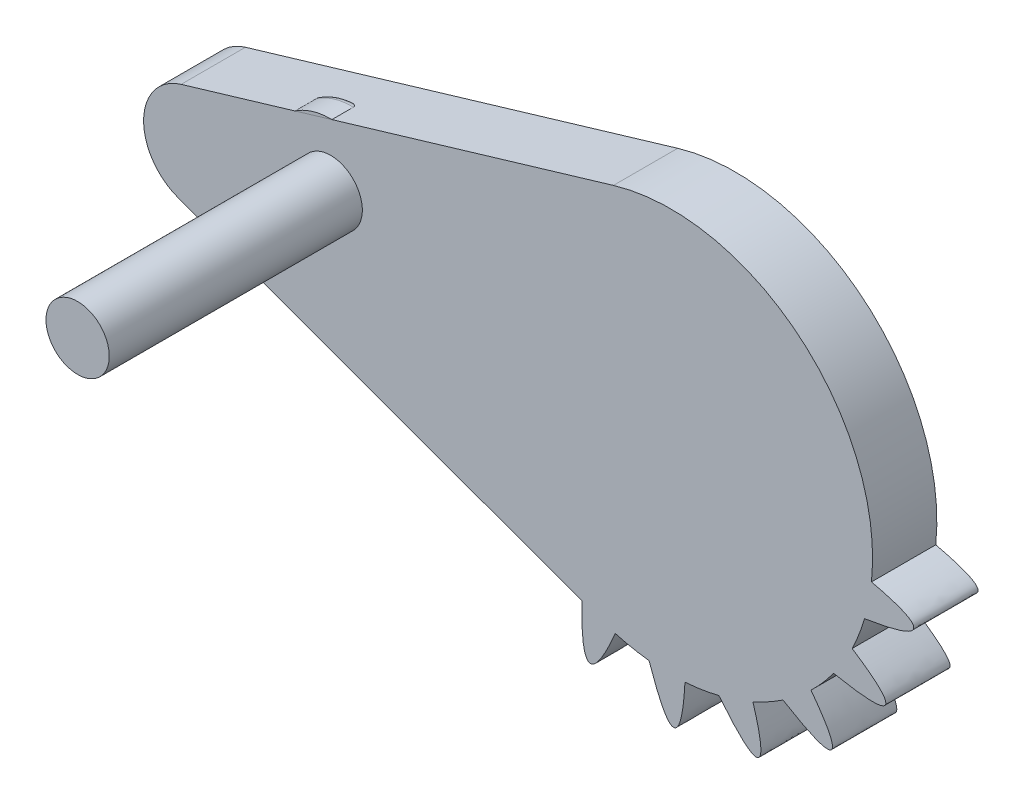
ISO-10303-21;
HEADER;
FILE_DESCRIPTION(('STEP AP214'),'2;1');
FILE_NAME('part.step','',(''),(''),'','','');
FILE_SCHEMA(('AUTOMOTIVE_DESIGN { 1 0 10303 214 1 1 1 1 }'));
ENDSEC;
DATA;
#1=APPLICATION_CONTEXT('core data for automotive mechanical design processes');
#2=APPLICATION_PROTOCOL_DEFINITION('international standard','automotive_design',2000,#1);
#3=PRODUCT_CONTEXT('',#1,'mechanical');
#4=PRODUCT('Part','Part','',(#3));
#5=PRODUCT_RELATED_PRODUCT_CATEGORY('part','',(#4));
#6=PRODUCT_DEFINITION_FORMATION('','',#4);
#7=PRODUCT_DEFINITION_CONTEXT('part definition',#1,'design');
#8=PRODUCT_DEFINITION('design','',#6,#7);
#9=PRODUCT_DEFINITION_SHAPE('','',#8);
#10=(LENGTH_UNIT() NAMED_UNIT(*) SI_UNIT(.MILLI.,.METRE.));
#11=(NAMED_UNIT(*) PLANE_ANGLE_UNIT() SI_UNIT($,.RADIAN.));
#12=(NAMED_UNIT(*) SI_UNIT($,.STERADIAN.) SOLID_ANGLE_UNIT());
#13=UNCERTAINTY_MEASURE_WITH_UNIT(LENGTH_MEASURE(1.E-05),#10,'distance_accuracy_value','');
#14=(GEOMETRIC_REPRESENTATION_CONTEXT(3) GLOBAL_UNCERTAINTY_ASSIGNED_CONTEXT((#13)) GLOBAL_UNIT_ASSIGNED_CONTEXT((#10,
#11,#12)) REPRESENTATION_CONTEXT('',''));
#15=CARTESIAN_POINT('',(0.,0.,0.));
#16=DIRECTION('',(0.,0.,1.));
#17=DIRECTION('',(1.,0.,0.));
#18=AXIS2_PLACEMENT_3D('',#15,#16,#17);
#19=CARTESIAN_POINT('',(-53.7801567329168,7.3152558516244,18.66));
#20=DIRECTION('',(0.,0.,-1.));
#21=DIRECTION('',(0.,1.,0.));
#22=AXIS2_PLACEMENT_3D('',#19,#20,#21);
#23=SPHERICAL_SURFACE('',#22,16.);
#24=CARTESIAN_POINT('',(-53.7801567329168,7.3152558516244,5.79558937890291));
#25=DIRECTION('',(0.,0.,-1.));
#26=DIRECTION('',(-1.,0.,0.));
#27=AXIS2_PLACEMENT_3D('',#24,#25,#26);
#28=CIRCLE('',#27,9.51351351351351);
#29=CARTESIAN_POINT('',(-63.2936702464303,7.3152558516244,5.79558937890291));
#30=VERTEX_POINT('',#29);
#31=EDGE_CURVE('E171',#30,#30,#28,.T.);
#32=ORIENTED_EDGE('',*,*,#31,.T.);
#33=EDGE_LOOP('',(#32));
#34=FACE_BOUND('',#33,.T.);
#35=CARTESIAN_POINT('',(-53.7801567329168,7.02835413391622,18.6383292627018));
#36=DIRECTION('',(0.,-0.997159481788596,-0.0753191069988102));
#37=DIRECTION('',(0.,-0.0753191069988102,0.997159481788596));
#38=AXIS2_PLACEMENT_3D('',#35,#36,#37);
#39=CIRCLE('',#38,15.9974128465674);
#40=CARTESIAN_POINT('',(-58.3457294105663,8.18315292111008,3.34979749311333));
#41=VERTEX_POINT('',#40);
#42=CARTESIAN_POINT('',(-54.6961888805334,8.231287999241,2.71253091524972));
#43=VERTEX_POINT('',#42);
#44=EDGE_CURVE('E202',#41,#43,#39,.T.);
#45=ORIENTED_EDGE('',*,*,#44,.F.);
#46=CARTESIAN_POINT('',(-49.2971362972055,7.31525585162442,15.2517266638189));
#47=DIRECTION('',(-0.796061428234295,0.,0.605215831317699));
#48=DIRECTION('',(0.605215831317699,0.,0.796061428234295));
#49=AXIS2_PLACEMENT_3D('',#46,#47,#48);
#50=CIRCLE('',#49,14.9761877872465);
#51=CARTESIAN_POINT('',(-58.3457294105663,6.44735878213869,3.34979749311333));
#52=VERTEX_POINT('',#51);
#53=EDGE_CURVE('E167',#41,#52,#50,.T.);
#54=ORIENTED_EDGE('',*,*,#53,.T.);
#55=CARTESIAN_POINT('',(-53.7801567329168,7.60215756933259,18.6383292627018));
#56=DIRECTION('',(0.,0.997159481788596,-0.0753191069988101));
#57=DIRECTION('',(0.,-0.0753191069988101,-0.997159481788596));
#58=AXIS2_PLACEMENT_3D('',#55,#56,#57);
#59=CIRCLE('',#58,15.9974128465674);
#60=CARTESIAN_POINT('',(-54.6961888805334,6.39922370400779,2.71253091524972));
#61=VERTEX_POINT('',#60);
#62=EDGE_CURVE('E123',#61,#52,#59,.T.);
#63=ORIENTED_EDGE('',*,*,#62,.F.);
#64=CARTESIAN_POINT('',(-53.4932550152086,7.3152558516244,18.6383292627018));
#65=DIRECTION('',(0.997159481788596,0.,-0.0753191069988103));
#66=DIRECTION('',(-0.0753191069988103,0.,-0.997159481788596));
#67=AXIS2_PLACEMENT_3D('',#64,#65,#66);
#68=CIRCLE('',#67,15.9974128465674);
#69=CARTESIAN_POINT('',(-54.6480538024025,2.74968317397494,3.34979749311333));
#70=VERTEX_POINT('',#69);
#71=EDGE_CURVE('E148',#70,#61,#68,.T.);
#72=ORIENTED_EDGE('',*,*,#71,.F.);
#73=CARTESIAN_POINT('',(-53.7801567329168,11.7982762873356,15.2517266638189));
#74=DIRECTION('',(0.,-0.796061428234295,0.605215831317699));
#75=DIRECTION('',(0.,0.605215831317699,0.796061428234295));
#76=AXIS2_PLACEMENT_3D('',#73,#74,#75);
#77=CIRCLE('',#76,14.9761877872465);
#78=CARTESIAN_POINT('',(-52.9122596634311,2.74968317397493,3.34979749311333));
#79=VERTEX_POINT('',#78);
#80=EDGE_CURVE('E156',#70,#79,#77,.T.);
#81=ORIENTED_EDGE('',*,*,#80,.T.);
#82=CARTESIAN_POINT('',(-54.067058450625,7.3152558516244,18.6383292627018));
#83=DIRECTION('',(-0.997159481788596,0.,-0.0753191069988101));
#84=DIRECTION('',(-0.0753191069988101,0.,0.997159481788596));
#85=AXIS2_PLACEMENT_3D('',#82,#83,#84);
#86=CIRCLE('',#85,15.9974128465674);
#87=CARTESIAN_POINT('',(-52.8641245853002,6.3992237040078,2.71253091524972));
#88=VERTEX_POINT('',#87);
#89=EDGE_CURVE('E66',#88,#79,#86,.T.);
#90=ORIENTED_EDGE('',*,*,#89,.F.);
#91=CARTESIAN_POINT('',(-49.2145840552673,6.44735878213873,3.34979749311333));
#92=VERTEX_POINT('',#91);
#93=EDGE_CURVE('E209',#92,#88,#59,.T.);
#94=ORIENTED_EDGE('',*,*,#93,.F.);
#95=CARTESIAN_POINT('',(-58.263177168628,7.31525585162438,15.2517266638189));
#96=DIRECTION('',(0.796061428234296,0.,0.605215831317699));
#97=DIRECTION('',(0.605215831317699,0.,-0.796061428234296));
#98=AXIS2_PLACEMENT_3D('',#95,#96,#97);
#99=CIRCLE('',#98,14.9761877872465);
#100=CARTESIAN_POINT('',(-49.2145840552673,8.18315292111011,3.34979749311333));
#101=VERTEX_POINT('',#100);
#102=EDGE_CURVE('E149',#92,#101,#99,.T.);
#103=ORIENTED_EDGE('',*,*,#102,.T.);
#104=CARTESIAN_POINT('',(-52.8641245853002,8.23128799924101,2.71253091524972));
#105=VERTEX_POINT('',#104);
#106=EDGE_CURVE('E197',#105,#101,#39,.T.);
#107=ORIENTED_EDGE('',*,*,#106,.F.);
#108=CARTESIAN_POINT('',(-52.9122596634311,11.8808285292739,3.34979749311334));
#109=VERTEX_POINT('',#108);
#110=EDGE_CURVE('E59',#109,#105,#86,.T.);
#111=ORIENTED_EDGE('',*,*,#110,.F.);
#112=CARTESIAN_POINT('',(-53.7801567329168,2.83223541591317,15.2517266638189));
#113=DIRECTION('',(0.,0.796061428234295,0.605215831317699));
#114=DIRECTION('',(0.,0.605215831317699,-0.796061428234295));
#115=AXIS2_PLACEMENT_3D('',#112,#113,#114);
#116=CIRCLE('',#115,14.9761877872465);
#117=CARTESIAN_POINT('',(-54.6480538024025,11.8808285292739,3.34979749311334));
#118=VERTEX_POINT('',#117);
#119=EDGE_CURVE('E12',#109,#118,#116,.T.);
#120=ORIENTED_EDGE('',*,*,#119,.T.);
#121=EDGE_CURVE('E185',#43,#118,#68,.T.);
#122=ORIENTED_EDGE('',*,*,#121,.F.);
#123=EDGE_LOOP('',(#45,#54,#63,#72,#81,#90,#94,#103,#107,#111,#120,#122));
#124=FACE_BOUND('',#123,.T.);
#125=ADVANCED_FACE('F51',(#34,#124),#23,.T.);
#126=CARTESIAN_POINT('',(-53.3658586767613,7.3152558516244,9.35505399568034));
#127=DIRECTION('',(-0.997159481788596,0.,-0.0753191069988101));
#128=DIRECTION('',(-0.0753191069988101,0.,0.997159481788596));
#129=AXIS2_PLACEMENT_3D('',#126,#127,#128);
#130=PLANE('',#129);
#131=ORIENTED_EDGE('',*,*,#110,.T.);
#132=DIRECTION('',(-0.075106370271242,-0.0751063702712424,0.994343032504054));
#133=VECTOR('',#132,1.);
#134=CARTESIAN_POINT('',(-53.3681957183643,7.72721686617691,9.38599439429393));
#135=LINE('',#134,#133);
#136=CARTESIAN_POINT('',(-53.3201567329168,7.7752558516244,8.74999999999999));
#137=VERTEX_POINT('',#136);
#138=EDGE_CURVE('E191',#105,#137,#135,.T.);
#139=ORIENTED_EDGE('',*,*,#138,.T.);
#140=DIRECTION('',(-0.0600210280625544,-0.60412469549919,0.794626219349906));
#141=VECTOR('',#140,1.);
#142=CARTESIAN_POINT('',(-52.8601567329168,12.4052558516244,2.66));
#143=LINE('',#142,#141);
#144=EDGE_CURVE('E172',#109,#137,#143,.T.);
#145=ORIENTED_EDGE('',*,*,#144,.F.);
#146=EDGE_LOOP('',(#131,#139,#145));
#147=FACE_BOUND('',#146,.T.);
#148=ADVANCED_FACE('F190',(#147),#130,.T.);
#149=DIRECTION('',(-0.0600210280625544,0.60412469549919,0.794626219349906));
#150=VECTOR('',#149,1.);
#151=CARTESIAN_POINT('',(-52.8601567329168,2.2252558516244,2.66));
#152=LINE('',#151,#150);
#153=CARTESIAN_POINT('',(-53.3201567329168,6.8552558516244,8.74999999999999));
#154=VERTEX_POINT('',#153);
#155=EDGE_CURVE('E157',#79,#154,#152,.T.);
#156=ORIENTED_EDGE('',*,*,#155,.T.);
#157=DIRECTION('',(0.075106370271242,-0.0751063702712418,-0.994343032504054));
#158=VECTOR('',#157,1.);
#159=CARTESIAN_POINT('',(-53.3681957183643,6.90329483707189,9.38599439429393));
#160=LINE('',#159,#158);
#161=EDGE_CURVE('E212',#154,#88,#160,.T.);
#162=ORIENTED_EDGE('',*,*,#161,.T.);
#163=ORIENTED_EDGE('',*,*,#89,.T.);
#164=EDGE_LOOP('',(#156,#162,#163));
#165=FACE_BOUND('',#164,.T.);
#166=ADVANCED_FACE('F227',(#165),#130,.T.);
#167=CARTESIAN_POINT('',(-54.1944547890723,7.3152558516244,9.35505399568034));
#168=DIRECTION('',(0.997159481788596,0.,-0.0753191069988103));
#169=DIRECTION('',(-0.0753191069988103,0.,-0.997159481788596));
#170=AXIS2_PLACEMENT_3D('',#167,#168,#169);
#171=PLANE('',#170);
#172=DIRECTION('',(0.0600210280625546,-0.60412469549919,0.794626219349906));
#173=VECTOR('',#172,1.);
#174=CARTESIAN_POINT('',(-54.7001567329168,12.4052558516244,2.66));
#175=LINE('',#174,#173);
#176=CARTESIAN_POINT('',(-54.2401567329168,7.7752558516244,8.74999999999999));
#177=VERTEX_POINT('',#176);
#178=EDGE_CURVE('E228',#118,#177,#175,.T.);
#179=ORIENTED_EDGE('',*,*,#178,.T.);
#180=DIRECTION('',(-0.0751063702712422,0.0751063702712419,-0.994343032504054));
#181=VECTOR('',#180,1.);
#182=CARTESIAN_POINT('',(-54.1921177474693,7.72721686617691,9.38599439429393));
#183=LINE('',#182,#181);
#184=EDGE_CURVE('E206',#177,#43,#183,.T.);
#185=ORIENTED_EDGE('',*,*,#184,.T.);
#186=ORIENTED_EDGE('',*,*,#121,.T.);
#187=EDGE_LOOP('',(#179,#185,#186));
#188=FACE_BOUND('',#187,.T.);
#189=ADVANCED_FACE('F232',(#188),#171,.T.);
#190=ORIENTED_EDGE('',*,*,#71,.T.);
#191=DIRECTION('',(0.0751063702712422,0.0751063702712424,0.994343032504054));
#192=VECTOR('',#191,1.);
#193=CARTESIAN_POINT('',(-54.1921177474693,6.90329483707189,9.38599439429393));
#194=LINE('',#193,#192);
#195=CARTESIAN_POINT('',(-54.2401567329168,6.8552558516244,8.74999999999999));
#196=VERTEX_POINT('',#195);
#197=EDGE_CURVE('E121',#61,#196,#194,.T.);
#198=ORIENTED_EDGE('',*,*,#197,.T.);
#199=DIRECTION('',(0.0600210280625544,0.60412469549919,0.794626219349906));
#200=VECTOR('',#199,1.);
#201=CARTESIAN_POINT('',(-54.7001567329168,2.2252558516244,2.66));
#202=LINE('',#201,#200);
#203=EDGE_CURVE('E146',#70,#196,#202,.T.);
#204=ORIENTED_EDGE('',*,*,#203,.F.);
#205=EDGE_LOOP('',(#190,#198,#204));
#206=FACE_BOUND('',#205,.T.);
#207=ADVANCED_FACE('F145',(#206),#171,.T.);
#208=CARTESIAN_POINT('',(-53.7801567329168,7.3152558516244,-22.74));
#209=DIRECTION('',(0.,0.,-1.));
#210=DIRECTION('',(-1.,0.,0.));
#211=AXIS2_PLACEMENT_3D('',#208,#209,#210);
#212=CYLINDRICAL_SURFACE('',#211,5.);
#213=CARTESIAN_POINT('',(-53.7801567329168,7.3152558516244,50.16));
#214=DIRECTION('',(0.,0.,-1.));
#215=DIRECTION('',(-1.,0.,0.));
#216=AXIS2_PLACEMENT_3D('',#213,#214,#215);
#217=CIRCLE('',#216,5.);
#218=CARTESIAN_POINT('',(-58.7801567329168,7.3152558516244,50.16));
#219=VERTEX_POINT('',#218);
#220=EDGE_CURVE('E168',#219,#219,#217,.T.);
#221=ORIENTED_EDGE('',*,*,#220,.T.);
#222=EDGE_LOOP('',(#221));
#223=FACE_BOUND('',#222,.T.);
#224=CARTESIAN_POINT('',(-53.7801567329168,7.3152558516244,10.16));
#225=DIRECTION('',(0.,0.,-1.));
#226=DIRECTION('',(-1.,0.,0.));
#227=AXIS2_PLACEMENT_3D('',#224,#225,#226);
#228=CIRCLE('',#227,5.);
#229=CARTESIAN_POINT('',(-58.7801567329168,7.3152558516244,10.16));
#230=VERTEX_POINT('',#229);
#231=EDGE_CURVE('E181',#230,#230,#228,.T.);
#232=ORIENTED_EDGE('',*,*,#231,.F.);
#233=EDGE_LOOP('',(#232));
#234=FACE_BOUND('',#233,.T.);
#235=ADVANCED_FACE('F53',(#223,#234),#212,.T.);
#236=CARTESIAN_POINT('',(-53.7801567329168,12.3152558516244,10.16));
#237=DIRECTION('',(0.,0.,-1.));
#238=DIRECTION('',(-1.,0.,0.));
#239=AXIS2_PLACEMENT_3D('',#236,#237,#238);
#240=PLANE('',#239);
#241=CARTESIAN_POINT('',(-53.7801567329168,7.3152558516244,10.16));
#242=DIRECTION('',(0.,0.,-1.));
#243=DIRECTION('',(-1.,0.,0.));
#244=AXIS2_PLACEMENT_3D('',#241,#242,#243);
#245=CIRCLE('',#244,10.);
#246=CARTESIAN_POINT('',(-63.7801567329168,7.3152558516244,10.16));
#247=VERTEX_POINT('',#246);
#248=EDGE_CURVE('E178',#247,#247,#245,.T.);
#249=ORIENTED_EDGE('',*,*,#248,.F.);
#250=EDGE_LOOP('',(#249));
#251=FACE_BOUND('',#250,.T.);
#252=ORIENTED_EDGE('',*,*,#231,.T.);
#253=EDGE_LOOP('',(#252));
#254=FACE_BOUND('',#253,.T.);
#255=ADVANCED_FACE('F260',(#251,#254),#240,.F.);
#256=CARTESIAN_POINT('',(-53.7801567329168,7.3152558516244,-22.74));
#257=DIRECTION('',(0.,0.,-1.));
#258=DIRECTION('',(-1.,0.,0.));
#259=AXIS2_PLACEMENT_3D('',#256,#257,#258);
#260=CYLINDRICAL_SURFACE('',#259,10.);
#261=ORIENTED_EDGE('',*,*,#248,.T.);
#262=EDGE_LOOP('',(#261));
#263=FACE_BOUND('',#262,.T.);
#264=CARTESIAN_POINT('',(-53.7801567329168,7.3152558516244,6.76042017548519));
#265=DIRECTION('',(0.,0.,-1.));
#266=DIRECTION('',(-1.,0.,0.));
#267=AXIS2_PLACEMENT_3D('',#264,#265,#266);
#268=CIRCLE('',#267,10.);
#269=CARTESIAN_POINT('',(-63.7801567329168,7.3152558516244,6.76042017548519));
#270=VERTEX_POINT('',#269);
#271=EDGE_CURVE('E175',#270,#270,#268,.T.);
#272=ORIENTED_EDGE('',*,*,#271,.F.);
#273=EDGE_LOOP('',(#272));
#274=FACE_BOUND('',#273,.T.);
#275=ADVANCED_FACE('F257',(#263,#274),#260,.T.);
#276=CARTESIAN_POINT('',(-53.7801567329168,7.3152558516244,6.76042017548519));
#277=DIRECTION('',(0.,0.,-1.));
#278=DIRECTION('',(-1.,0.,0.));
#279=AXIS2_PLACEMENT_3D('',#276,#277,#278);
#280=TOROIDAL_SURFACE('',#279,8.8,1.2);
#281=ORIENTED_EDGE('',*,*,#271,.T.);
#282=EDGE_LOOP('',(#281));
#283=FACE_BOUND('',#282,.T.);
#284=ORIENTED_EDGE('',*,*,#31,.F.);
#285=EDGE_LOOP('',(#284));
#286=FACE_BOUND('',#285,.T.);
#287=ADVANCED_FACE('F254',(#283,#286),#280,.T.);
#288=CARTESIAN_POINT('',(-53.7801567329168,12.3152558516244,50.16));
#289=DIRECTION('',(0.,0.,1.));
#290=DIRECTION('',(1.,0.,0.));
#291=AXIS2_PLACEMENT_3D('',#288,#289,#290);
#292=PLANE('',#291);
#293=ORIENTED_EDGE('',*,*,#220,.F.);
#294=EDGE_LOOP('',(#293));
#295=FACE_BOUND('',#294,.T.);
#296=ADVANCED_FACE('F252',(#295),#292,.T.);
#297=CARTESIAN_POINT('',(-54.2401567329168,7.7752558516244,8.74999999999999));
#298=DIRECTION('',(0.,0.796061428234295,0.605215831317699));
#299=DIRECTION('',(0.,0.605215831317699,-0.796061428234295));
#300=AXIS2_PLACEMENT_3D('',#297,#298,#299);
#301=PLANE('',#300);
#302=ORIENTED_EDGE('',*,*,#144,.T.);
#303=DIRECTION('',(1.,0.,0.));
#304=VECTOR('',#303,1.);
#305=CARTESIAN_POINT('',(-54.2401567329168,7.7752558516244,8.74999999999999));
#306=LINE('',#305,#304);
#307=EDGE_CURVE('E139',#177,#137,#306,.T.);
#308=ORIENTED_EDGE('',*,*,#307,.F.);
#309=ORIENTED_EDGE('',*,*,#178,.F.);
#310=ORIENTED_EDGE('',*,*,#119,.F.);
#311=EDGE_LOOP('',(#302,#308,#309,#310));
#312=FACE_BOUND('',#311,.T.);
#313=ADVANCED_FACE('F231',(#312),#301,.F.);
#314=CARTESIAN_POINT('',(-53.3201567329168,6.8552558516244,8.74999999999999));
#315=DIRECTION('',(0.,-0.796061428234295,0.605215831317699));
#316=DIRECTION('',(0.,0.605215831317699,0.796061428234295));
#317=AXIS2_PLACEMENT_3D('',#314,#315,#316);
#318=PLANE('',#317);
#319=ORIENTED_EDGE('',*,*,#203,.T.);
#320=DIRECTION('',(-1.,0.,0.));
#321=VECTOR('',#320,1.);
#322=CARTESIAN_POINT('',(-53.3201567329168,6.8552558516244,8.74999999999999));
#323=LINE('',#322,#321);
#324=EDGE_CURVE('E138',#154,#196,#323,.T.);
#325=ORIENTED_EDGE('',*,*,#324,.F.);
#326=ORIENTED_EDGE('',*,*,#155,.F.);
#327=ORIENTED_EDGE('',*,*,#80,.F.);
#328=EDGE_LOOP('',(#319,#325,#326,#327));
#329=FACE_BOUND('',#328,.T.);
#330=ADVANCED_FACE('F153',(#329),#318,.F.);
#331=CARTESIAN_POINT('',(-53.3201567329168,7.7752558516244,8.74999999999999));
#332=DIRECTION('',(0.,0.,-1.));
#333=DIRECTION('',(-1.,0.,0.));
#334=AXIS2_PLACEMENT_3D('',#331,#332,#333);
#335=PLANE('',#334);
#336=DIRECTION('',(0.,1.,0.));
#337=VECTOR('',#336,1.);
#338=CARTESIAN_POINT('',(-53.3201567329168,6.8552558516244,8.74999999999999));
#339=LINE('',#338,#337);
#340=EDGE_CURVE('E161',#154,#137,#339,.T.);
#341=ORIENTED_EDGE('',*,*,#340,.F.);
#342=ORIENTED_EDGE('',*,*,#324,.T.);
#343=DIRECTION('',(0.,-1.,0.));
#344=VECTOR('',#343,1.);
#345=CARTESIAN_POINT('',(-54.2401567329168,7.7752558516244,8.74999999999999));
#346=LINE('',#345,#344);
#347=EDGE_CURVE('E130',#177,#196,#346,.T.);
#348=ORIENTED_EDGE('',*,*,#347,.F.);
#349=ORIENTED_EDGE('',*,*,#307,.T.);
#350=EDGE_LOOP('',(#341,#342,#348,#349));
#351=FACE_BOUND('',#350,.T.);
#352=ADVANCED_FACE('F159',(#351),#335,.T.);
#353=CARTESIAN_POINT('',(-53.3201567329168,7.7752558516244,8.74999999999999));
#354=DIRECTION('',(0.796061428234296,0.,0.605215831317699));
#355=DIRECTION('',(-0.605215831317699,0.,0.796061428234296));
#356=AXIS2_PLACEMENT_3D('',#353,#354,#355);
#357=PLANE('',#356);
#358=DIRECTION('',(-0.60412469549919,0.0600210280625522,0.794626219349906));
#359=VECTOR('',#358,1.);
#360=CARTESIAN_POINT('',(-48.6901567329168,6.39525585162442,2.66));
#361=LINE('',#360,#359);
#362=EDGE_CURVE('E217',#92,#154,#361,.T.);
#363=ORIENTED_EDGE('',*,*,#362,.T.);
#364=ORIENTED_EDGE('',*,*,#340,.T.);
#365=DIRECTION('',(-0.604124695499189,-0.0600210280625566,0.794626219349906));
#366=VECTOR('',#365,1.);
#367=CARTESIAN_POINT('',(-48.6901567329168,8.23525585162442,2.66));
#368=LINE('',#367,#366);
#369=EDGE_CURVE('E127',#101,#137,#368,.T.);
#370=ORIENTED_EDGE('',*,*,#369,.F.);
#371=ORIENTED_EDGE('',*,*,#102,.F.);
#372=EDGE_LOOP('',(#363,#364,#370,#371));
#373=FACE_BOUND('',#372,.T.);
#374=ADVANCED_FACE('F222',(#373),#357,.F.);
#375=CARTESIAN_POINT('',(-53.7801567329168,6.9009577954689,9.35505399568034));
#376=DIRECTION('',(0.,0.997159481788596,-0.0753191069988101));
#377=DIRECTION('',(0.,-0.0753191069988101,-0.997159481788596));
#378=AXIS2_PLACEMENT_3D('',#375,#376,#377);
#379=PLANE('',#378);
#380=ORIENTED_EDGE('',*,*,#93,.T.);
#381=ORIENTED_EDGE('',*,*,#161,.F.);
#382=ORIENTED_EDGE('',*,*,#362,.F.);
#383=EDGE_LOOP('',(#380,#381,#382));
#384=FACE_BOUND('',#383,.T.);
#385=ADVANCED_FACE('F226',(#384),#379,.T.);
#386=CARTESIAN_POINT('',(-53.7801567329168,7.72955390777991,9.35505399568034));
#387=DIRECTION('',(0.,-0.997159481788596,-0.0753191069988102));
#388=DIRECTION('',(0.,-0.0753191069988102,0.997159481788596));
#389=AXIS2_PLACEMENT_3D('',#386,#387,#388);
#390=PLANE('',#389);
#391=ORIENTED_EDGE('',*,*,#106,.T.);
#392=ORIENTED_EDGE('',*,*,#369,.T.);
#393=ORIENTED_EDGE('',*,*,#138,.F.);
#394=EDGE_LOOP('',(#391,#392,#393));
#395=FACE_BOUND('',#394,.T.);
#396=ADVANCED_FACE('F220',(#395),#390,.T.);
#397=CARTESIAN_POINT('',(-54.2401567329168,6.8552558516244,8.74999999999999));
#398=DIRECTION('',(-0.796061428234295,0.,0.605215831317699));
#399=DIRECTION('',(-0.605215831317699,0.,-0.796061428234295));
#400=AXIS2_PLACEMENT_3D('',#397,#398,#399);
#401=PLANE('',#400);
#402=DIRECTION('',(0.60412469549919,-0.0600210280625524,0.794626219349906));
#403=VECTOR('',#402,1.);
#404=CARTESIAN_POINT('',(-58.8701567329168,8.23525585162438,2.66));
#405=LINE('',#404,#403);
#406=EDGE_CURVE('E126',#41,#177,#405,.T.);
#407=ORIENTED_EDGE('',*,*,#406,.T.);
#408=ORIENTED_EDGE('',*,*,#347,.T.);
#409=DIRECTION('',(0.60412469549919,0.0600210280625566,0.794626219349906));
#410=VECTOR('',#409,1.);
#411=CARTESIAN_POINT('',(-58.8701567329168,6.39525585162438,2.66));
#412=LINE('',#411,#410);
#413=EDGE_CURVE('E117',#52,#196,#412,.T.);
#414=ORIENTED_EDGE('',*,*,#413,.F.);
#415=ORIENTED_EDGE('',*,*,#53,.F.);
#416=EDGE_LOOP('',(#407,#408,#414,#415));
#417=FACE_BOUND('',#416,.T.);
#418=ADVANCED_FACE('F131',(#417),#401,.F.);
#419=ORIENTED_EDGE('',*,*,#44,.T.);
#420=ORIENTED_EDGE('',*,*,#184,.F.);
#421=ORIENTED_EDGE('',*,*,#406,.F.);
#422=EDGE_LOOP('',(#419,#420,#421));
#423=FACE_BOUND('',#422,.T.);
#424=ADVANCED_FACE('F233',(#423),#390,.T.);
#425=ORIENTED_EDGE('',*,*,#62,.T.);
#426=ORIENTED_EDGE('',*,*,#413,.T.);
#427=ORIENTED_EDGE('',*,*,#197,.F.);
#428=EDGE_LOOP('',(#425,#426,#427));
#429=FACE_BOUND('',#428,.T.);
#430=ADVANCED_FACE('F119',(#429),#379,.T.);
#431=CLOSED_SHELL('',(#125,#148,#166,#189,#207,#235,#255,#275,#287,#296,#313,#330,#352,#374,
#385,#396,#418,#424,#430));
#432=MANIFOLD_SOLID_BREP('B2',#431);
#433=CARTESIAN_POINT('',(-10.9091067584318,-29.947141983702,10.16));
#434=DIRECTION('',(-0.342276083083845,-0.93959942685635,0.));
#435=DIRECTION('',(0.93959942685635,-0.342276083083845,0.));
#436=AXIS2_PLACEMENT_3D('',#433,#434,#435);
#437=PLANE('',#436);
#438=DIRECTION('',(-0.93959942685635,0.342276083083845,0.));
#439=VECTOR('',#438,1.);
#440=CARTESIAN_POINT('',(-10.9091067584318,-29.947141983702,0.));
#441=LINE('',#440,#439);
#442=CARTESIAN_POINT('',(-14.0944633003984,-28.7867843576255,0.));
#443=VERTEX_POINT('',#442);
#444=CARTESIAN_POINT('',(-77.8937628772521,-5.54605672572497,0.));
#445=VERTEX_POINT('',#444);
#446=EDGE_CURVE('E537',#443,#445,#441,.T.);
#447=ORIENTED_EDGE('',*,*,#446,.F.);
#448=DIRECTION('',(0.,0.,-1.));
#449=VECTOR('',#448,1.);
#450=CARTESIAN_POINT('',(-14.0944633003984,-28.7867843576255,10.16));
#451=LINE('',#450,#449);
#452=CARTESIAN_POINT('',(-14.0944633003984,-28.7867843576255,10.16));
#453=VERTEX_POINT('',#452);
#454=EDGE_CURVE('E49',#453,#443,#451,.T.);
#455=ORIENTED_EDGE('',*,*,#454,.F.);
#456=DIRECTION('',(-0.93959942685635,0.342276083083845,0.));
#457=VECTOR('',#456,1.);
#458=CARTESIAN_POINT('',(-10.9091067584318,-29.947141983702,10.16));
#459=LINE('',#458,#457);
#460=CARTESIAN_POINT('',(-77.8937628772521,-5.54605672572497,10.16));
#461=VERTEX_POINT('',#460);
#462=EDGE_CURVE('E596',#453,#461,#459,.T.);
#463=ORIENTED_EDGE('',*,*,#462,.T.);
#464=DIRECTION('',(0.,0.,-1.));
#465=VECTOR('',#464,1.);
#466=CARTESIAN_POINT('',(-77.8937628772521,-5.54605672572497,10.16));
#467=LINE('',#466,#465);
#468=EDGE_CURVE('E474',#461,#445,#467,.T.);
#469=ORIENTED_EDGE('',*,*,#468,.T.);
#470=EDGE_LOOP('',(#447,#455,#463,#469));
#471=FACE_BOUND('',#470,.T.);
#472=ADVANCED_FACE('F402',(#471),#437,.T.);
#473=CARTESIAN_POINT('',(-14.0908818136356,-28.5882313718953,10.16));
#474=CARTESIAN_POINT('',(-14.3820640679685,-43.7501508568254,10.16));
#475=CARTESIAN_POINT('',(-8.79226143471801,-30.6355359365955,10.16));
#476=B_SPLINE_CURVE_WITH_KNOTS('',2,(#473,#474,#475),.UNSPECIFIED.,.F.,.F.,(3,3),(0.,1.),.UNSPECIFIED.);
#477=DIRECTION('',(0.,0.,-1.));
#478=VECTOR('',#477,1.);
#479=SURFACE_OF_LINEAR_EXTRUSION('',#476,#478);
#480=CARTESIAN_POINT('',(-14.0908818136356,-28.5882313718953,0.));
#481=CARTESIAN_POINT('',(-14.3820640679685,-43.7501508568254,0.));
#482=CARTESIAN_POINT('',(-8.79226143471801,-30.6355359365955,0.));
#483=B_SPLINE_CURVE_WITH_KNOTS('',2,(#480,#481,#482),.UNSPECIFIED.,.F.,.F.,(3,3),(0.,1.),.UNSPECIFIED.);
#484=CARTESIAN_POINT('',(-8.79226143471803,-30.6355359365955,0.));
#485=VERTEX_POINT('',#484);
#486=EDGE_CURVE('E540',#443,#485,#483,.T.);
#487=ORIENTED_EDGE('',*,*,#486,.T.);
#488=DIRECTION('',(0.,0.,-1.));
#489=VECTOR('',#488,1.);
#490=CARTESIAN_POINT('',(-8.79226143471803,-30.6355359365955,10.16));
#491=LINE('',#490,#489);
#492=CARTESIAN_POINT('',(-8.79226143471803,-30.6355359365955,10.16));
#493=VERTEX_POINT('',#492);
#494=EDGE_CURVE('E410',#493,#485,#491,.T.);
#495=ORIENTED_EDGE('',*,*,#494,.F.);
#496=EDGE_CURVE('E685',#453,#493,#476,.T.);
#497=ORIENTED_EDGE('',*,*,#496,.F.);
#498=ORIENTED_EDGE('',*,*,#454,.T.);
#499=EDGE_LOOP('',(#487,#495,#497,#498));
#500=FACE_BOUND('',#499,.T.);
#501=ADVANCED_FACE('F682',(#500),#479,.F.);
#502=CARTESIAN_POINT('',(0.,0.,10.16));
#503=DIRECTION('',(0.,0.,-1.));
#504=DIRECTION('',(-1.,0.,0.));
#505=AXIS2_PLACEMENT_3D('',#502,#503,#504);
#506=CYLINDRICAL_SURFACE('',#505,31.8722437750916);
#507=CARTESIAN_POINT('',(0.,0.,0.));
#508=DIRECTION('',(0.,0.,1.));
#509=DIRECTION('',(1.,0.,0.));
#510=AXIS2_PLACEMENT_3D('',#507,#508,#509);
#511=CIRCLE('',#510,31.8722437750916);
#512=CARTESIAN_POINT('',(-3.46334666939711,-31.6835154789749,0.));
#513=VERTEX_POINT('',#512);
#514=EDGE_CURVE('E544',#485,#513,#511,.T.);
#515=ORIENTED_EDGE('',*,*,#514,.T.);
#516=DIRECTION('',(0.,0.,-1.));
#517=VECTOR('',#516,1.);
#518=CARTESIAN_POINT('',(-3.46334666939711,-31.6835154789749,10.16));
#519=LINE('',#518,#517);
#520=CARTESIAN_POINT('',(-3.46334666939711,-31.6835154789749,10.16));
#521=VERTEX_POINT('',#520);
#522=EDGE_CURVE('E624',#521,#513,#519,.T.);
#523=ORIENTED_EDGE('',*,*,#522,.F.);
#524=CARTESIAN_POINT('',(0.,0.,10.16));
#525=DIRECTION('',(0.,0.,1.));
#526=DIRECTION('',(1.,0.,0.));
#527=AXIS2_PLACEMENT_3D('',#524,#525,#526);
#528=CIRCLE('',#527,31.8722437750916);
#529=EDGE_CURVE('E633',#493,#521,#528,.T.);
#530=ORIENTED_EDGE('',*,*,#529,.F.);
#531=ORIENTED_EDGE('',*,*,#494,.T.);
#532=EDGE_LOOP('',(#515,#523,#530,#531));
#533=FACE_BOUND('',#532,.T.);
#534=ADVANCED_FACE('F631',(#533),#506,.T.);
#535=CARTESIAN_POINT('',(-3.46334666939711,-31.6835154789749,10.16));
#536=CARTESIAN_POINT('',(1.4487133902303,-46.0306495322747,10.16));
#537=CARTESIAN_POINT('',(2.21594720166764,-31.7951175694994,10.16));
#538=B_SPLINE_CURVE_WITH_KNOTS('',2,(#535,#536,#537),.UNSPECIFIED.,.F.,.F.,(3,3),(0.,1.),.UNSPECIFIED.);
#539=DIRECTION('',(0.,0.,-1.));
#540=VECTOR('',#539,1.);
#541=SURFACE_OF_LINEAR_EXTRUSION('',#538,#540);
#542=CARTESIAN_POINT('',(-3.46334666939711,-31.6835154789749,0.));
#543=CARTESIAN_POINT('',(1.4487133902303,-46.0306495322747,0.));
#544=CARTESIAN_POINT('',(2.21594720166764,-31.7951175694994,0.));
#545=B_SPLINE_CURVE_WITH_KNOTS('',2,(#542,#543,#544),.UNSPECIFIED.,.F.,.F.,(3,3),(0.,1.),.UNSPECIFIED.);
#546=CARTESIAN_POINT('',(2.21594720166765,-31.7951175694994,0.));
#547=VERTEX_POINT('',#546);
#548=EDGE_CURVE('E549',#513,#547,#545,.T.);
#549=ORIENTED_EDGE('',*,*,#548,.T.);
#550=DIRECTION('',(0.,0.,-1.));
#551=VECTOR('',#550,1.);
#552=CARTESIAN_POINT('',(2.21594720166765,-31.7951175694994,10.16));
#553=LINE('',#552,#551);
#554=CARTESIAN_POINT('',(2.21594720166765,-31.7951175694994,10.16));
#555=VERTEX_POINT('',#554);
#556=EDGE_CURVE('E621',#555,#547,#553,.T.);
#557=ORIENTED_EDGE('',*,*,#556,.F.);
#558=EDGE_CURVE('E652',#521,#555,#538,.T.);
#559=ORIENTED_EDGE('',*,*,#558,.F.);
#560=ORIENTED_EDGE('',*,*,#522,.T.);
#561=EDGE_LOOP('',(#549,#557,#559,#560));
#562=FACE_BOUND('',#561,.T.);
#563=ADVANCED_FACE('F643',(#562),#541,.F.);
#564=CARTESIAN_POINT('',(0.,0.,10.16));
#565=DIRECTION('',(0.,0.,-1.));
#566=DIRECTION('',(-1.,0.,0.));
#567=AXIS2_PLACEMENT_3D('',#564,#565,#566);
#568=CYLINDRICAL_SURFACE('',#567,31.8722437750916);
#569=CARTESIAN_POINT('',(0.,0.,0.));
#570=DIRECTION('',(0.,0.,1.));
#571=DIRECTION('',(1.,0.,0.));
#572=AXIS2_PLACEMENT_3D('',#569,#570,#571);
#573=CIRCLE('',#572,31.8722437750916);
#574=CARTESIAN_POINT('',(7.58191919672414,-30.9573000204025,0.));
#575=VERTEX_POINT('',#574);
#576=EDGE_CURVE('E553',#547,#575,#573,.T.);
#577=ORIENTED_EDGE('',*,*,#576,.T.);
#578=DIRECTION('',(0.,0.,-1.));
#579=VECTOR('',#578,1.);
#580=CARTESIAN_POINT('',(7.58191919672414,-30.9573000204025,10.16));
#581=LINE('',#580,#579);
#582=CARTESIAN_POINT('',(7.58191919672414,-30.9573000204025,10.16));
#583=VERTEX_POINT('',#582);
#584=EDGE_CURVE('E618',#583,#575,#581,.T.);
#585=ORIENTED_EDGE('',*,*,#584,.F.);
#586=CARTESIAN_POINT('',(0.,0.,10.16));
#587=DIRECTION('',(0.,0.,1.));
#588=DIRECTION('',(1.,0.,0.));
#589=AXIS2_PLACEMENT_3D('',#586,#587,#588);
#590=CIRCLE('',#589,31.8722437750916);
#591=EDGE_CURVE('E649',#555,#583,#590,.T.);
#592=ORIENTED_EDGE('',*,*,#591,.F.);
#593=ORIENTED_EDGE('',*,*,#556,.T.);
#594=EDGE_LOOP('',(#577,#585,#592,#593));
#595=FACE_BOUND('',#594,.T.);
#596=ADVANCED_FACE('F647',(#595),#568,.T.);
#597=CARTESIAN_POINT('',(7.58191919672413,-30.9573000204025,10.16));
#598=CARTESIAN_POINT('',(17.1047546328354,-42.7591725340965,10.16));
#599=CARTESIAN_POINT('',(12.9568799016349,-29.1197387775625,10.16));
#600=B_SPLINE_CURVE_WITH_KNOTS('',2,(#597,#598,#599),.UNSPECIFIED.,.F.,.F.,(3,3),(0.,1.),.UNSPECIFIED.);
#601=DIRECTION('',(0.,0.,-1.));
#602=VECTOR('',#601,1.);
#603=SURFACE_OF_LINEAR_EXTRUSION('',#600,#602);
#604=CARTESIAN_POINT('',(7.58191919672413,-30.9573000204025,0.));
#605=CARTESIAN_POINT('',(17.1047546328354,-42.7591725340965,0.));
#606=CARTESIAN_POINT('',(12.9568799016349,-29.1197387775625,0.));
#607=B_SPLINE_CURVE_WITH_KNOTS('',2,(#604,#605,#606),.UNSPECIFIED.,.F.,.F.,(3,3),(0.,1.),.UNSPECIFIED.);
#608=CARTESIAN_POINT('',(12.9568799016349,-29.1197387775625,0.));
#609=VERTEX_POINT('',#608);
#610=EDGE_CURVE('E558',#575,#609,#607,.T.);
#611=ORIENTED_EDGE('',*,*,#610,.T.);
#612=DIRECTION('',(0.,0.,-1.));
#613=VECTOR('',#612,1.);
#614=CARTESIAN_POINT('',(12.9568799016349,-29.1197387775625,10.16));
#615=LINE('',#614,#613);
#616=CARTESIAN_POINT('',(12.9568799016349,-29.1197387775625,10.16));
#617=VERTEX_POINT('',#616);
#618=EDGE_CURVE('E615',#617,#609,#615,.T.);
#619=ORIENTED_EDGE('',*,*,#618,.F.);
#620=EDGE_CURVE('E651',#583,#617,#600,.T.);
#621=ORIENTED_EDGE('',*,*,#620,.F.);
#622=ORIENTED_EDGE('',*,*,#584,.T.);
#623=EDGE_LOOP('',(#611,#619,#621,#622));
#624=FACE_BOUND('',#623,.T.);
#625=ADVANCED_FACE('F670',(#624),#603,.F.);
#626=CARTESIAN_POINT('',(0.,0.,10.16));
#627=DIRECTION('',(0.,0.,-1.));
#628=DIRECTION('',(-1.,0.,0.));
#629=AXIS2_PLACEMENT_3D('',#626,#627,#628);
#630=CYLINDRICAL_SURFACE('',#629,31.8722437750916);
#631=CARTESIAN_POINT('',(0.,0.,0.));
#632=DIRECTION('',(0.,0.,1.));
#633=DIRECTION('',(1.,0.,0.));
#634=AXIS2_PLACEMENT_3D('',#631,#632,#633);
#635=CIRCLE('',#634,31.8722437750916);
#636=CARTESIAN_POINT('',(17.7126937105105,-26.4971772982804,0.));
#637=VERTEX_POINT('',#636);
#638=EDGE_CURVE('E562',#609,#637,#635,.T.);
#639=ORIENTED_EDGE('',*,*,#638,.T.);
#640=DIRECTION('',(0.,0.,-1.));
#641=VECTOR('',#640,1.);
#642=CARTESIAN_POINT('',(17.7126937105105,-26.4971772982804,10.16));
#643=LINE('',#642,#641);
#644=CARTESIAN_POINT('',(17.7126937105105,-26.4971772982804,10.16));
#645=VERTEX_POINT('',#644);
#646=EDGE_CURVE('E612',#645,#637,#643,.T.);
#647=ORIENTED_EDGE('',*,*,#646,.F.);
#648=CARTESIAN_POINT('',(0.,0.,10.16));
#649=DIRECTION('',(0.,0.,1.));
#650=DIRECTION('',(1.,0.,0.));
#651=AXIS2_PLACEMENT_3D('',#648,#649,#650);
#652=CIRCLE('',#651,31.8722437750916);
#653=EDGE_CURVE('E654',#617,#645,#652,.T.);
#654=ORIENTED_EDGE('',*,*,#653,.F.);
#655=ORIENTED_EDGE('',*,*,#618,.T.);
#656=EDGE_LOOP('',(#639,#647,#654,#655));
#657=FACE_BOUND('',#656,.T.);
#658=ADVANCED_FACE('F674',(#657),#630,.T.);
#659=CARTESIAN_POINT('',(17.7126937105105,-26.4971772982804,10.16));
#660=CARTESIAN_POINT('',(30.6977100274277,-34.3303082701291,10.16));
#661=CARTESIAN_POINT('',(22.1350216622836,-22.932089727478,10.16));
#662=B_SPLINE_CURVE_WITH_KNOTS('',2,(#659,#660,#661),.UNSPECIFIED.,.F.,.F.,(3,3),(0.,1.),.UNSPECIFIED.);
#663=DIRECTION('',(0.,0.,-1.));
#664=VECTOR('',#663,1.);
#665=SURFACE_OF_LINEAR_EXTRUSION('',#662,#664);
#666=CARTESIAN_POINT('',(17.7126937105105,-26.4971772982804,0.));
#667=CARTESIAN_POINT('',(30.6977100274277,-34.3303082701291,0.));
#668=CARTESIAN_POINT('',(22.1350216622836,-22.932089727478,0.));
#669=B_SPLINE_CURVE_WITH_KNOTS('',2,(#666,#667,#668),.UNSPECIFIED.,.F.,.F.,(3,3),(0.,1.),.UNSPECIFIED.);
#670=CARTESIAN_POINT('',(22.1350216622836,-22.932089727478,0.));
#671=VERTEX_POINT('',#670);
#672=EDGE_CURVE('E567',#637,#671,#669,.T.);
#673=ORIENTED_EDGE('',*,*,#672,.T.);
#674=DIRECTION('',(0.,0.,-1.));
#675=VECTOR('',#674,1.);
#676=CARTESIAN_POINT('',(22.1350216622836,-22.932089727478,10.16));
#677=LINE('',#676,#675);
#678=CARTESIAN_POINT('',(22.1350216622836,-22.932089727478,10.16));
#679=VERTEX_POINT('',#678);
#680=EDGE_CURVE('E609',#679,#671,#677,.T.);
#681=ORIENTED_EDGE('',*,*,#680,.F.);
#682=EDGE_CURVE('E847',#645,#679,#662,.T.);
#683=ORIENTED_EDGE('',*,*,#682,.F.);
#684=ORIENTED_EDGE('',*,*,#646,.T.);
#685=EDGE_LOOP('',(#673,#681,#683,#684));
#686=FACE_BOUND('',#685,.T.);
#687=ADVANCED_FACE('F722',(#686),#665,.F.);
#688=CARTESIAN_POINT('',(0.,0.,10.16));
#689=DIRECTION('',(0.,0.,-1.));
#690=DIRECTION('',(-1.,0.,0.));
#691=AXIS2_PLACEMENT_3D('',#688,#689,#690);
#692=CYLINDRICAL_SURFACE('',#691,31.8722437750916);
#693=CARTESIAN_POINT('',(0.,0.,0.));
#694=DIRECTION('',(0.,0.,1.));
#695=DIRECTION('',(1.,0.,0.));
#696=AXIS2_PLACEMENT_3D('',#693,#694,#695);
#697=CIRCLE('',#696,31.8722437750916);
#698=CARTESIAN_POINT('',(25.7070559512912,-18.8411039372975,0.));
#699=VERTEX_POINT('',#698);
#700=EDGE_CURVE('E571',#671,#699,#697,.T.);
#701=ORIENTED_EDGE('',*,*,#700,.T.);
#702=DIRECTION('',(0.,0.,-1.));
#703=VECTOR('',#702,1.);
#704=CARTESIAN_POINT('',(25.7070559512912,-18.8411039372975,10.16));
#705=LINE('',#704,#703);
#706=CARTESIAN_POINT('',(25.7070559512912,-18.8411039372975,10.16));
#707=VERTEX_POINT('',#706);
#708=EDGE_CURVE('E606',#707,#699,#705,.T.);
#709=ORIENTED_EDGE('',*,*,#708,.F.);
#710=CARTESIAN_POINT('',(0.,0.,10.16));
#711=DIRECTION('',(0.,0.,1.));
#712=DIRECTION('',(1.,0.,0.));
#713=AXIS2_PLACEMENT_3D('',#710,#711,#712);
#714=CIRCLE('',#713,31.8722437750916);
#715=EDGE_CURVE('E843',#679,#707,#714,.T.);
#716=ORIENTED_EDGE('',*,*,#715,.F.);
#717=ORIENTED_EDGE('',*,*,#680,.T.);
#718=EDGE_LOOP('',(#701,#709,#716,#717));
#719=FACE_BOUND('',#718,.T.);
#720=ADVANCED_FACE('F729',(#719),#692,.T.);
#721=CARTESIAN_POINT('',(25.7070559512912,-18.8411039372975,10.16));
#722=CARTESIAN_POINT('',(40.5880685427633,-21.7607021673951,10.16));
#723=CARTESIAN_POINT('',(28.6433531323333,-13.9784922146604,10.16));
#724=B_SPLINE_CURVE_WITH_KNOTS('',2,(#721,#722,#723),.UNSPECIFIED.,.F.,.F.,(3,3),(0.,1.),.UNSPECIFIED.);
#725=DIRECTION('',(0.,0.,-1.));
#726=VECTOR('',#725,1.);
#727=SURFACE_OF_LINEAR_EXTRUSION('',#724,#726);
#728=CARTESIAN_POINT('',(25.7070559512912,-18.8411039372975,0.));
#729=CARTESIAN_POINT('',(40.5880685427633,-21.7607021673951,0.));
#730=CARTESIAN_POINT('',(28.6433531323333,-13.9784922146604,0.));
#731=B_SPLINE_CURVE_WITH_KNOTS('',2,(#728,#729,#730),.UNSPECIFIED.,.F.,.F.,(3,3),(0.,1.),.UNSPECIFIED.);
#732=CARTESIAN_POINT('',(28.6433531323332,-13.9784922146604,0.));
#733=VERTEX_POINT('',#732);
#734=EDGE_CURVE('E576',#699,#733,#731,.T.);
#735=ORIENTED_EDGE('',*,*,#734,.T.);
#736=DIRECTION('',(0.,0.,-1.));
#737=VECTOR('',#736,1.);
#738=CARTESIAN_POINT('',(28.6433531323332,-13.9784922146604,10.16));
#739=LINE('',#738,#737);
#740=CARTESIAN_POINT('',(28.6433531323332,-13.9784922146604,10.16));
#741=VERTEX_POINT('',#740);
#742=EDGE_CURVE('E603',#741,#733,#739,.T.);
#743=ORIENTED_EDGE('',*,*,#742,.F.);
#744=EDGE_CURVE('E838',#707,#741,#724,.T.);
#745=ORIENTED_EDGE('',*,*,#744,.F.);
#746=ORIENTED_EDGE('',*,*,#708,.T.);
#747=EDGE_LOOP('',(#735,#743,#745,#746));
#748=FACE_BOUND('',#747,.T.);
#749=ADVANCED_FACE('F736',(#748),#727,.F.);
#750=CARTESIAN_POINT('',(0.,0.,10.16));
#751=DIRECTION('',(0.,0.,-1.));
#752=DIRECTION('',(-1.,0.,0.));
#753=AXIS2_PLACEMENT_3D('',#750,#751,#752);
#754=CYLINDRICAL_SURFACE('',#753,31.8722437750916);
#755=CARTESIAN_POINT('',(0.,0.,0.));
#756=DIRECTION('',(0.,0.,1.));
#757=DIRECTION('',(1.,0.,0.));
#758=AXIS2_PLACEMENT_3D('',#755,#756,#757);
#759=CIRCLE('',#758,31.8722437750916);
#760=CARTESIAN_POINT('',(30.6007678486072,-8.91251537639717,0.));
#761=VERTEX_POINT('',#760);
#762=EDGE_CURVE('E580',#733,#761,#759,.T.);
#763=ORIENTED_EDGE('',*,*,#762,.T.);
#764=DIRECTION('',(0.,0.,-1.));
#765=VECTOR('',#764,1.);
#766=CARTESIAN_POINT('',(30.6007678486072,-8.91251537639717,10.16));
#767=LINE('',#766,#765);
#768=CARTESIAN_POINT('',(30.6007678486072,-8.91251537639717,10.16));
#769=VERTEX_POINT('',#768);
#770=EDGE_CURVE('E600',#769,#761,#767,.T.);
#771=ORIENTED_EDGE('',*,*,#770,.F.);
#772=CARTESIAN_POINT('',(0.,0.,10.16));
#773=DIRECTION('',(0.,0.,1.));
#774=DIRECTION('',(1.,0.,0.));
#775=AXIS2_PLACEMENT_3D('',#772,#773,#774);
#776=CIRCLE('',#775,31.8722437750916);
#777=EDGE_CURVE('E833',#741,#769,#776,.T.);
#778=ORIENTED_EDGE('',*,*,#777,.F.);
#779=ORIENTED_EDGE('',*,*,#742,.T.);
#780=EDGE_LOOP('',(#763,#771,#778,#779));
#781=FACE_BOUND('',#780,.T.);
#782=ADVANCED_FACE('F744',(#781),#754,.T.);
#783=CARTESIAN_POINT('',(30.6007678486072,-8.91251537639717,10.16));
#784=CARTESIAN_POINT('',(45.5829069757471,-6.56643422951311,10.16));
#785=CARTESIAN_POINT('',(31.6968734837534,-3.33888224018128,10.16));
#786=B_SPLINE_CURVE_WITH_KNOTS('',2,(#783,#784,#785),.UNSPECIFIED.,.F.,.F.,(3,3),(0.,1.),.UNSPECIFIED.);
#787=DIRECTION('',(0.,0.,-1.));
#788=VECTOR('',#787,1.);
#789=SURFACE_OF_LINEAR_EXTRUSION('',#786,#788);
#790=CARTESIAN_POINT('',(30.6007678486072,-8.91251537639717,0.));
#791=CARTESIAN_POINT('',(45.5829069757471,-6.56643422951311,0.));
#792=CARTESIAN_POINT('',(31.6968734837534,-3.33888224018128,0.));
#793=B_SPLINE_CURVE_WITH_KNOTS('',2,(#790,#791,#792),.UNSPECIFIED.,.F.,.F.,(3,3),(0.,1.),.UNSPECIFIED.);
#794=CARTESIAN_POINT('',(31.6968734837534,-3.3388822401813,0.));
#795=VERTEX_POINT('',#794);
#796=EDGE_CURVE('E585',#761,#795,#793,.T.);
#797=ORIENTED_EDGE('',*,*,#796,.T.);
#798=DIRECTION('',(0.,0.,-1.));
#799=VECTOR('',#798,1.);
#800=CARTESIAN_POINT('',(31.6968734837534,-3.3388822401813,10.16));
#801=LINE('',#800,#799);
#802=CARTESIAN_POINT('',(31.6968734837534,-3.3388822401813,10.16));
#803=VERTEX_POINT('',#802);
#804=EDGE_CURVE('E529',#803,#795,#801,.T.);
#805=ORIENTED_EDGE('',*,*,#804,.F.);
#806=EDGE_CURVE('E520',#769,#803,#786,.T.);
#807=ORIENTED_EDGE('',*,*,#806,.F.);
#808=ORIENTED_EDGE('',*,*,#770,.T.);
#809=EDGE_LOOP('',(#797,#805,#807,#808));
#810=FACE_BOUND('',#809,.T.);
#811=ADVANCED_FACE('F752',(#810),#789,.F.);
#812=CARTESIAN_POINT('',(0.,0.,10.16));
#813=DIRECTION('',(0.,0.,-1.));
#814=DIRECTION('',(-1.,0.,0.));
#815=AXIS2_PLACEMENT_3D('',#812,#813,#814);
#816=CYLINDRICAL_SURFACE('',#815,31.8722437750916);
#817=CARTESIAN_POINT('',(0.,0.,0.));
#818=DIRECTION('',(0.,0.,1.));
#819=DIRECTION('',(1.,0.,0.));
#820=AXIS2_PLACEMENT_3D('',#817,#818,#819);
#821=CIRCLE('',#820,31.8722437750916);
#822=CARTESIAN_POINT('',(-9.09006735403841,30.5484958509893,0.));
#823=VERTEX_POINT('',#822);
#824=EDGE_CURVE('E528',#795,#823,#821,.T.);
#825=ORIENTED_EDGE('',*,*,#824,.T.);
#826=DIRECTION('',(0.,0.,-1.));
#827=VECTOR('',#826,1.);
#828=CARTESIAN_POINT('',(-9.09006735403841,30.5484958509893,10.16));
#829=LINE('',#828,#827);
#830=CARTESIAN_POINT('',(-9.09006735403841,30.5484958509893,10.16));
#831=VERTEX_POINT('',#830);
#832=EDGE_CURVE('E525',#831,#823,#829,.T.);
#833=ORIENTED_EDGE('',*,*,#832,.F.);
#834=CARTESIAN_POINT('',(0.,0.,10.16));
#835=DIRECTION('',(0.,0.,1.));
#836=DIRECTION('',(1.,0.,0.));
#837=AXIS2_PLACEMENT_3D('',#834,#835,#836);
#838=CIRCLE('',#837,31.8722437750916);
#839=EDGE_CURVE('E514',#803,#831,#838,.T.);
#840=ORIENTED_EDGE('',*,*,#839,.F.);
#841=ORIENTED_EDGE('',*,*,#804,.T.);
#842=EDGE_LOOP('',(#825,#833,#840,#841));
#843=FACE_BOUND('',#842,.T.);
#844=ADVANCED_FACE('F526',(#843),#816,.T.);
#845=CARTESIAN_POINT('',(-9.09006735403841,30.5484958509893,10.16));
#846=DIRECTION('',(0.285203245123971,-0.958467062016612,0.));
#847=DIRECTION('',(0.958467062016612,0.285203245123971,0.));
#848=AXIS2_PLACEMENT_3D('',#845,#846,#847);
#849=PLANE('',#848);
#850=DIRECTION('',(-0.958467062016612,-0.285203245123971,0.));
#851=VECTOR('',#850,1.);
#852=CARTESIAN_POINT('',(-9.09006735403841,30.5484958509893,0.));
#853=LINE('',#852,#851);
#854=CARTESIAN_POINT('',(-77.419809492349,10.216170444493,0.));
#855=VERTEX_POINT('',#854);
#856=EDGE_CURVE('E467',#823,#855,#853,.T.);
#857=ORIENTED_EDGE('',*,*,#856,.T.);
#858=DIRECTION('',(0.,0.,-1.));
#859=VECTOR('',#858,1.);
#860=CARTESIAN_POINT('',(-77.419809492349,10.216170444493,10.16));
#861=LINE('',#860,#859);
#862=CARTESIAN_POINT('',(-77.419809492349,10.216170444493,10.16));
#863=VERTEX_POINT('',#862);
#864=EDGE_CURVE('E530',#863,#855,#861,.T.);
#865=ORIENTED_EDGE('',*,*,#864,.F.);
#866=DIRECTION('',(-0.958467062016612,-0.285203245123971,0.));
#867=VECTOR('',#866,1.);
#868=CARTESIAN_POINT('',(-9.09006735403841,30.5484958509893,10.16));
#869=LINE('',#868,#867);
#870=EDGE_CURVE('E518',#831,#863,#869,.T.);
#871=ORIENTED_EDGE('',*,*,#870,.F.);
#872=ORIENTED_EDGE('',*,*,#832,.T.);
#873=EDGE_LOOP('',(#857,#865,#871,#872));
#874=FACE_BOUND('',#873,.T.);
#875=ADVANCED_FACE('F532',(#874),#849,.F.);
#876=CARTESIAN_POINT('',(-75.051379110336,2.25671504330319,10.16));
#877=DIRECTION('',(0.,0.,-1.));
#878=DIRECTION('',(-1.,0.,0.));
#879=AXIS2_PLACEMENT_3D('',#876,#877,#878);
#880=CYLINDRICAL_SURFACE('',#879,8.30435986443091);
#881=CARTESIAN_POINT('',(-75.051379110336,2.25671504330319,0.));
#882=DIRECTION('',(0.,0.,1.));
#883=DIRECTION('',(1.,0.,0.));
#884=AXIS2_PLACEMENT_3D('',#881,#882,#883);
#885=CIRCLE('',#884,8.30435986443091);
#886=EDGE_CURVE('E594',#855,#445,#885,.T.);
#887=ORIENTED_EDGE('',*,*,#886,.T.);
#888=ORIENTED_EDGE('',*,*,#468,.F.);
#889=CARTESIAN_POINT('',(-75.051379110336,2.25671504330319,10.16));
#890=DIRECTION('',(0.,0.,1.));
#891=DIRECTION('',(1.,0.,0.));
#892=AXIS2_PLACEMENT_3D('',#889,#890,#891);
#893=CIRCLE('',#892,8.30435986443091);
#894=EDGE_CURVE('E418',#863,#461,#893,.T.);
#895=ORIENTED_EDGE('',*,*,#894,.F.);
#896=ORIENTED_EDGE('',*,*,#864,.T.);
#897=EDGE_LOOP('',(#887,#888,#895,#896));
#898=FACE_BOUND('',#897,.T.);
#899=ADVANCED_FACE('F773',(#898),#880,.T.);
#900=CARTESIAN_POINT('',(0.,0.,10.16));
#901=DIRECTION('',(0.,0.,1.));
#902=DIRECTION('',(1.,0.,0.));
#903=AXIS2_PLACEMENT_3D('',#900,#901,#902);
#904=PLANE('',#903);
#905=ORIENTED_EDGE('',*,*,#462,.F.);
#906=ORIENTED_EDGE('',*,*,#496,.T.);
#907=ORIENTED_EDGE('',*,*,#529,.T.);
#908=ORIENTED_EDGE('',*,*,#558,.T.);
#909=ORIENTED_EDGE('',*,*,#591,.T.);
#910=ORIENTED_EDGE('',*,*,#620,.T.);
#911=ORIENTED_EDGE('',*,*,#653,.T.);
#912=ORIENTED_EDGE('',*,*,#682,.T.);
#913=ORIENTED_EDGE('',*,*,#715,.T.);
#914=ORIENTED_EDGE('',*,*,#744,.T.);
#915=ORIENTED_EDGE('',*,*,#777,.T.);
#916=ORIENTED_EDGE('',*,*,#806,.T.);
#917=ORIENTED_EDGE('',*,*,#839,.T.);
#918=ORIENTED_EDGE('',*,*,#870,.T.);
#919=ORIENTED_EDGE('',*,*,#894,.T.);
#920=EDGE_LOOP('',(#905,#906,#907,#908,#909,#910,#911,#912,#913,#914,#915,#916,#917,#918,#919));
#921=FACE_BOUND('',#920,.T.);
#922=ADVANCED_FACE('F516',(#921),#904,.T.);
#923=CARTESIAN_POINT('',(0.,0.,0.));
#924=DIRECTION('',(0.,0.,1.));
#925=DIRECTION('',(1.,0.,0.));
#926=AXIS2_PLACEMENT_3D('',#923,#924,#925);
#927=PLANE('',#926);
#928=ORIENTED_EDGE('',*,*,#446,.T.);
#929=ORIENTED_EDGE('',*,*,#886,.F.);
#930=ORIENTED_EDGE('',*,*,#856,.F.);
#931=ORIENTED_EDGE('',*,*,#824,.F.);
#932=ORIENTED_EDGE('',*,*,#796,.F.);
#933=ORIENTED_EDGE('',*,*,#762,.F.);
#934=ORIENTED_EDGE('',*,*,#734,.F.);
#935=ORIENTED_EDGE('',*,*,#700,.F.);
#936=ORIENTED_EDGE('',*,*,#672,.F.);
#937=ORIENTED_EDGE('',*,*,#638,.F.);
#938=ORIENTED_EDGE('',*,*,#610,.F.);
#939=ORIENTED_EDGE('',*,*,#576,.F.);
#940=ORIENTED_EDGE('',*,*,#548,.F.);
#941=ORIENTED_EDGE('',*,*,#514,.F.);
#942=ORIENTED_EDGE('',*,*,#486,.F.);
#943=EDGE_LOOP('',(#928,#929,#930,#931,#932,#933,#934,#935,#936,#937,#938,#939,#940,#941,#942));
#944=FACE_BOUND('',#943,.T.);
#945=ADVANCED_FACE('F638',(#944),#927,.F.);
#946=CLOSED_SHELL('',(#472,#501,#534,#563,#596,#625,#658,#687,#720,#749,#782,#811,#844,#875,
#899,#922,#945));
#947=MANIFOLD_SOLID_BREP('B6',#946);
#948=ADVANCED_BREP_SHAPE_REPRESENTATION('',(#18,#432,#947),#14);
#949=SHAPE_DEFINITION_REPRESENTATION(#9,#948);
ENDSEC;
END-ISO-10303-21;
